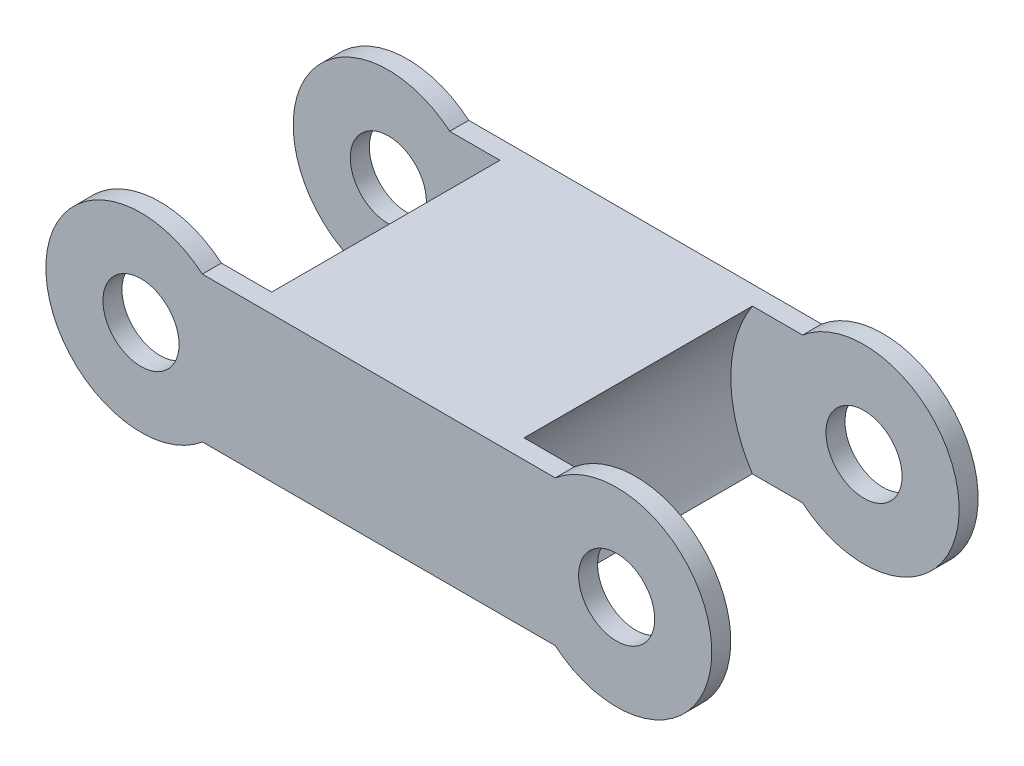
ISO-10303-21;
HEADER;
FILE_DESCRIPTION(('STEP AP214'),'2;1');
FILE_NAME('part.step','',(''),(''),'','','');
FILE_SCHEMA(('AUTOMOTIVE_DESIGN { 1 0 10303 214 1 1 1 1 }'));
ENDSEC;
DATA;
#1=APPLICATION_CONTEXT('core data for automotive mechanical design processes');
#2=APPLICATION_PROTOCOL_DEFINITION('international standard','automotive_design',2000,#1);
#3=PRODUCT_CONTEXT('',#1,'mechanical');
#4=PRODUCT('Part','Part','',(#3));
#5=PRODUCT_RELATED_PRODUCT_CATEGORY('part','',(#4));
#6=PRODUCT_DEFINITION_FORMATION('','',#4);
#7=PRODUCT_DEFINITION_CONTEXT('part definition',#1,'design');
#8=PRODUCT_DEFINITION('design','',#6,#7);
#9=PRODUCT_DEFINITION_SHAPE('','',#8);
#10=(LENGTH_UNIT() NAMED_UNIT(*) SI_UNIT(.MILLI.,.METRE.));
#11=(NAMED_UNIT(*) PLANE_ANGLE_UNIT() SI_UNIT($,.RADIAN.));
#12=(NAMED_UNIT(*) SI_UNIT($,.STERADIAN.) SOLID_ANGLE_UNIT());
#13=UNCERTAINTY_MEASURE_WITH_UNIT(LENGTH_MEASURE(1.E-05),#10,'distance_accuracy_value','');
#14=(GEOMETRIC_REPRESENTATION_CONTEXT(3) GLOBAL_UNCERTAINTY_ASSIGNED_CONTEXT((#13)) GLOBAL_UNIT_ASSIGNED_CONTEXT((#10,
#11,#12)) REPRESENTATION_CONTEXT('',''));
#15=CARTESIAN_POINT('',(0.,0.,0.));
#16=DIRECTION('',(0.,0.,1.));
#17=DIRECTION('',(1.,0.,0.));
#18=AXIS2_PLACEMENT_3D('',#15,#16,#17);
#19=CARTESIAN_POINT('',(0.,-8.62727902108439,-14.));
#20=DIRECTION('',(0.,-1.,0.));
#21=DIRECTION('',(0.,0.,-1.));
#22=AXIS2_PLACEMENT_3D('',#19,#20,#21);
#23=PLANE('',#22);
#24=DIRECTION('',(0.,0.,-1.));
#25=VECTOR('',#24,1.);
#26=CARTESIAN_POINT('',(-12.5604431779841,-8.62727902108439,12.));
#27=LINE('',#26,#25);
#28=CARTESIAN_POINT('',(-12.5604431779841,-8.62727902108439,-12.));
#29=VERTEX_POINT('',#28);
#30=CARTESIAN_POINT('',(-12.5604431779841,-8.62727902108439,12.));
#31=VERTEX_POINT('',#30);
#32=EDGE_CURVE('E246',#29,#31,#27,.F.);
#33=ORIENTED_EDGE('',*,*,#32,.F.);
#34=DIRECTION('',(1.,0.,0.));
#35=VECTOR('',#34,1.);
#36=CARTESIAN_POINT('',(0.,-8.62727902108439,-12.));
#37=LINE('',#36,#35);
#38=CARTESIAN_POINT('',(-17.8396055816999,-8.62727902108439,-12.));
#39=VERTEX_POINT('',#38);
#40=EDGE_CURVE('E265',#39,#29,#37,.T.);
#41=ORIENTED_EDGE('',*,*,#40,.F.);
#42=DIRECTION('',(0.,0.,1.));
#43=VECTOR('',#42,1.);
#44=CARTESIAN_POINT('',(-17.8396055816999,-8.62727902108439,-14.));
#45=LINE('',#44,#43);
#46=CARTESIAN_POINT('',(-17.8396055816999,-8.62727902108439,-14.));
#47=VERTEX_POINT('',#46);
#48=EDGE_CURVE('E134',#47,#39,#45,.T.);
#49=ORIENTED_EDGE('',*,*,#48,.F.);
#50=DIRECTION('',(1.,0.,0.));
#51=VECTOR('',#50,1.);
#52=CARTESIAN_POINT('',(0.,-8.62727902108439,-14.));
#53=LINE('',#52,#51);
#54=CARTESIAN_POINT('',(19.2548538978497,-8.62727902108438,-14.));
#55=VERTEX_POINT('',#54);
#56=EDGE_CURVE('E295',#47,#55,#53,.T.);
#57=ORIENTED_EDGE('',*,*,#56,.T.);
#58=DIRECTION('',(0.,0.,1.));
#59=VECTOR('',#58,1.);
#60=CARTESIAN_POINT('',(19.2548538978497,-8.62727902108438,-14.));
#61=LINE('',#60,#59);
#62=CARTESIAN_POINT('',(19.2548538978497,-8.62727902108438,-12.));
#63=VERTEX_POINT('',#62);
#64=EDGE_CURVE('E323',#55,#63,#61,.T.);
#65=ORIENTED_EDGE('',*,*,#64,.T.);
#66=DIRECTION('',(1.,0.,0.));
#67=VECTOR('',#66,1.);
#68=CARTESIAN_POINT('',(0.,-8.62727902108439,-12.));
#69=LINE('',#68,#67);
#70=CARTESIAN_POINT('',(13.9756914941339,-8.62727902108439,-12.));
#71=VERTEX_POINT('',#70);
#72=EDGE_CURVE('E227',#71,#63,#69,.T.);
#73=ORIENTED_EDGE('',*,*,#72,.F.);
#74=DIRECTION('',(0.,0.,-1.));
#75=VECTOR('',#74,1.);
#76=CARTESIAN_POINT('',(13.9756914941339,-8.62727902108439,12.));
#77=LINE('',#76,#75);
#78=CARTESIAN_POINT('',(13.9756914941339,-8.62727902108439,12.));
#79=VERTEX_POINT('',#78);
#80=EDGE_CURVE('E234',#71,#79,#77,.F.);
#81=ORIENTED_EDGE('',*,*,#80,.T.);
#82=DIRECTION('',(1.,0.,0.));
#83=VECTOR('',#82,1.);
#84=CARTESIAN_POINT('',(0.,-8.62727902108439,12.));
#85=LINE('',#84,#83);
#86=CARTESIAN_POINT('',(19.2548538978497,-8.62727902108438,12.));
#87=VERTEX_POINT('',#86);
#88=EDGE_CURVE('E254',#79,#87,#85,.T.);
#89=ORIENTED_EDGE('',*,*,#88,.T.);
#90=CARTESIAN_POINT('',(19.2548538978497,-8.62727902108438,14.));
#91=VERTEX_POINT('',#90);
#92=EDGE_CURVE('E312',#87,#91,#61,.T.);
#93=ORIENTED_EDGE('',*,*,#92,.T.);
#94=DIRECTION('',(1.,0.,0.));
#95=VECTOR('',#94,1.);
#96=CARTESIAN_POINT('',(0.,-8.62727902108439,14.));
#97=LINE('',#96,#95);
#98=CARTESIAN_POINT('',(-17.8396055816999,-8.62727902108439,14.));
#99=VERTEX_POINT('',#98);
#100=EDGE_CURVE('E277',#99,#91,#97,.T.);
#101=ORIENTED_EDGE('',*,*,#100,.F.);
#102=CARTESIAN_POINT('',(-17.8396055816999,-8.62727902108439,12.));
#103=VERTEX_POINT('',#102);
#104=EDGE_CURVE('E315',#103,#99,#45,.T.);
#105=ORIENTED_EDGE('',*,*,#104,.F.);
#106=DIRECTION('',(1.,0.,0.));
#107=VECTOR('',#106,1.);
#108=CARTESIAN_POINT('',(0.,-8.62727902108439,12.));
#109=LINE('',#108,#107);
#110=EDGE_CURVE('E273',#103,#31,#109,.T.);
#111=ORIENTED_EDGE('',*,*,#110,.T.);
#112=EDGE_LOOP('',(#33,#41,#49,#57,#65,#73,#81,#89,#93,#101,#105,#111));
#113=FACE_BOUND('',#112,.T.);
#114=ADVANCED_FACE('F127',(#113),#23,.T.);
#115=CARTESIAN_POINT('',(-24.2923758419251,-0.987792391162618,-14.));
#116=DIRECTION('',(0.,0.,1.));
#117=DIRECTION('',(1.,0.,0.));
#118=AXIS2_PLACEMENT_3D('',#115,#116,#117);
#119=CYLINDRICAL_SURFACE('',#118,10.);
#120=DIRECTION('',(0.,0.,1.));
#121=VECTOR('',#120,1.);
#122=CARTESIAN_POINT('',(-17.8396055816999,6.65169423875915,-14.));
#123=LINE('',#122,#121);
#124=CARTESIAN_POINT('',(-17.8396055816999,6.65169423875915,12.));
#125=VERTEX_POINT('',#124);
#126=CARTESIAN_POINT('',(-17.8396055816999,6.65169423875915,14.));
#127=VERTEX_POINT('',#126);
#128=EDGE_CURVE('E319',#125,#127,#123,.T.);
#129=ORIENTED_EDGE('',*,*,#128,.F.);
#130=CARTESIAN_POINT('',(-24.2923758419251,-0.987792391162618,12.));
#131=DIRECTION('',(0.,0.,-1.));
#132=DIRECTION('',(-1.,0.,0.));
#133=AXIS2_PLACEMENT_3D('',#130,#131,#132);
#134=CIRCLE('',#133,10.);
#135=EDGE_CURVE('E270',#125,#103,#134,.F.);
#136=ORIENTED_EDGE('',*,*,#135,.T.);
#137=ORIENTED_EDGE('',*,*,#104,.T.);
#138=CARTESIAN_POINT('',(-24.2923758419251,-0.987792391162618,14.));
#139=DIRECTION('',(0.,0.,1.));
#140=DIRECTION('',(1.,0.,0.));
#141=AXIS2_PLACEMENT_3D('',#138,#139,#140);
#142=CIRCLE('',#141,10.);
#143=EDGE_CURVE('E286',#127,#99,#142,.T.);
#144=ORIENTED_EDGE('',*,*,#143,.F.);
#145=EDGE_LOOP('',(#129,#136,#137,#144));
#146=FACE_BOUND('',#145,.T.);
#147=ADVANCED_FACE('F345',(#146),#119,.T.);
#148=CARTESIAN_POINT('',(0.,6.65169423875915,-14.));
#149=DIRECTION('',(0.,-1.,0.));
#150=DIRECTION('',(0.,0.,-1.));
#151=AXIS2_PLACEMENT_3D('',#148,#149,#150);
#152=PLANE('',#151);
#153=DIRECTION('',(0.,0.,1.));
#154=VECTOR('',#153,1.);
#155=CARTESIAN_POINT('',(13.9756914941339,6.65169423875915,-12.));
#156=LINE('',#155,#154);
#157=CARTESIAN_POINT('',(13.9756914941339,6.65169423875915,-12.));
#158=VERTEX_POINT('',#157);
#159=CARTESIAN_POINT('',(13.9756914941339,6.65169423875915,12.));
#160=VERTEX_POINT('',#159);
#161=EDGE_CURVE('E232',#158,#160,#156,.T.);
#162=ORIENTED_EDGE('',*,*,#161,.F.);
#163=DIRECTION('',(1.,0.,0.));
#164=VECTOR('',#163,1.);
#165=CARTESIAN_POINT('',(0.,6.65169423875915,-12.));
#166=LINE('',#165,#164);
#167=CARTESIAN_POINT('',(19.2548538978497,6.65169423875915,-12.));
#168=VERTEX_POINT('',#167);
#169=EDGE_CURVE('E215',#158,#168,#166,.T.);
#170=ORIENTED_EDGE('',*,*,#169,.T.);
#171=DIRECTION('',(0.,0.,1.));
#172=VECTOR('',#171,1.);
#173=CARTESIAN_POINT('',(19.2548538978497,6.65169423875915,-14.));
#174=LINE('',#173,#172);
#175=CARTESIAN_POINT('',(19.2548538978497,6.65169423875915,-14.));
#176=VERTEX_POINT('',#175);
#177=EDGE_CURVE('E320',#176,#168,#174,.T.);
#178=ORIENTED_EDGE('',*,*,#177,.F.);
#179=DIRECTION('',(1.,0.,0.));
#180=VECTOR('',#179,1.);
#181=CARTESIAN_POINT('',(0.,6.65169423875915,-14.));
#182=LINE('',#181,#180);
#183=CARTESIAN_POINT('',(-17.8396055816999,6.65169423875915,-14.));
#184=VERTEX_POINT('',#183);
#185=EDGE_CURVE('E301',#184,#176,#182,.T.);
#186=ORIENTED_EDGE('',*,*,#185,.F.);
#187=CARTESIAN_POINT('',(-17.8396055816999,6.65169423875915,-12.));
#188=VERTEX_POINT('',#187);
#189=EDGE_CURVE('E316',#184,#188,#123,.T.);
#190=ORIENTED_EDGE('',*,*,#189,.T.);
#191=DIRECTION('',(1.,0.,0.));
#192=VECTOR('',#191,1.);
#193=CARTESIAN_POINT('',(0.,6.65169423875915,-12.));
#194=LINE('',#193,#192);
#195=CARTESIAN_POINT('',(-12.5604431779841,6.65169423875915,-12.));
#196=VERTEX_POINT('',#195);
#197=EDGE_CURVE('E260',#188,#196,#194,.T.);
#198=ORIENTED_EDGE('',*,*,#197,.T.);
#199=DIRECTION('',(0.,0.,-1.));
#200=VECTOR('',#199,1.);
#201=CARTESIAN_POINT('',(-12.5604431779841,6.65169423875915,12.));
#202=LINE('',#201,#200);
#203=CARTESIAN_POINT('',(-12.5604431779841,6.65169423875915,12.));
#204=VERTEX_POINT('',#203);
#205=EDGE_CURVE('E12',#204,#196,#202,.T.);
#206=ORIENTED_EDGE('',*,*,#205,.F.);
#207=DIRECTION('',(1.,0.,0.));
#208=VECTOR('',#207,1.);
#209=CARTESIAN_POINT('',(0.,6.65169423875915,12.));
#210=LINE('',#209,#208);
#211=EDGE_CURVE('E268',#125,#204,#210,.T.);
#212=ORIENTED_EDGE('',*,*,#211,.F.);
#213=ORIENTED_EDGE('',*,*,#128,.T.);
#214=DIRECTION('',(1.,0.,0.));
#215=VECTOR('',#214,1.);
#216=CARTESIAN_POINT('',(0.,6.65169423875915,14.));
#217=LINE('',#216,#215);
#218=CARTESIAN_POINT('',(19.2548538978497,6.65169423875915,14.));
#219=VERTEX_POINT('',#218);
#220=EDGE_CURVE('E283',#127,#219,#217,.T.);
#221=ORIENTED_EDGE('',*,*,#220,.T.);
#222=CARTESIAN_POINT('',(19.2548538978497,6.65169423875915,12.));
#223=VERTEX_POINT('',#222);
#224=EDGE_CURVE('E322',#223,#219,#174,.T.);
#225=ORIENTED_EDGE('',*,*,#224,.F.);
#226=DIRECTION('',(1.,0.,0.));
#227=VECTOR('',#226,1.);
#228=CARTESIAN_POINT('',(0.,6.65169423875915,12.));
#229=LINE('',#228,#227);
#230=EDGE_CURVE('E148',#160,#223,#229,.T.);
#231=ORIENTED_EDGE('',*,*,#230,.F.);
#232=EDGE_LOOP('',(#162,#170,#178,#186,#190,#198,#206,#212,#213,#221,#225,#231));
#233=FACE_BOUND('',#232,.T.);
#234=ADVANCED_FACE('F237',(#233),#152,.F.);
#235=CARTESIAN_POINT('',(-24.2923758419251,-0.987792391162618,-14.));
#236=DIRECTION('',(0.,0.,1.));
#237=DIRECTION('',(1.,0.,0.));
#238=AXIS2_PLACEMENT_3D('',#235,#236,#237);
#239=CYLINDRICAL_SURFACE('',#238,4.);
#240=CARTESIAN_POINT('',(-24.2923758419251,-0.987792391162618,14.));
#241=DIRECTION('',(0.,0.,1.));
#242=DIRECTION('',(1.,0.,0.));
#243=AXIS2_PLACEMENT_3D('',#240,#241,#242);
#244=CIRCLE('',#243,4.);
#245=CARTESIAN_POINT('',(-20.2923758419251,-0.987792391162618,14.));
#246=VERTEX_POINT('',#245);
#247=EDGE_CURVE('E289',#246,#246,#244,.T.);
#248=ORIENTED_EDGE('',*,*,#247,.T.);
#249=EDGE_LOOP('',(#248));
#250=FACE_BOUND('',#249,.T.);
#251=CARTESIAN_POINT('',(-24.2923758419251,-0.987792391162618,12.));
#252=DIRECTION('',(0.,0.,-1.));
#253=DIRECTION('',(-1.,0.,0.));
#254=AXIS2_PLACEMENT_3D('',#251,#252,#253);
#255=CIRCLE('',#254,4.);
#256=CARTESIAN_POINT('',(-28.2923758419251,-0.987792391162618,12.));
#257=VERTEX_POINT('',#256);
#258=EDGE_CURVE('E267',#257,#257,#255,.F.);
#259=ORIENTED_EDGE('',*,*,#258,.F.);
#260=EDGE_LOOP('',(#259));
#261=FACE_BOUND('',#260,.T.);
#262=ADVANCED_FACE('F332',(#250,#261),#239,.F.);
#263=CARTESIAN_POINT('',(25.7076241580749,-0.987792391162618,-14.));
#264=DIRECTION('',(0.,0.,1.));
#265=DIRECTION('',(1.,0.,0.));
#266=AXIS2_PLACEMENT_3D('',#263,#264,#265);
#267=CYLINDRICAL_SURFACE('',#266,10.);
#268=ORIENTED_EDGE('',*,*,#92,.F.);
#269=CARTESIAN_POINT('',(25.7076241580749,-0.987792391162618,12.));
#270=DIRECTION('',(0.,0.,-1.));
#271=DIRECTION('',(-1.,0.,0.));
#272=AXIS2_PLACEMENT_3D('',#269,#270,#271);
#273=CIRCLE('',#272,10.);
#274=EDGE_CURVE('E239',#87,#223,#273,.F.);
#275=ORIENTED_EDGE('',*,*,#274,.T.);
#276=ORIENTED_EDGE('',*,*,#224,.T.);
#277=CARTESIAN_POINT('',(25.7076241580749,-0.987792391162618,14.));
#278=DIRECTION('',(0.,0.,1.));
#279=DIRECTION('',(1.,0.,0.));
#280=AXIS2_PLACEMENT_3D('',#277,#278,#279);
#281=CIRCLE('',#280,10.);
#282=EDGE_CURVE('E280',#91,#219,#281,.T.);
#283=ORIENTED_EDGE('',*,*,#282,.F.);
#284=EDGE_LOOP('',(#268,#275,#276,#283));
#285=FACE_BOUND('',#284,.T.);
#286=ADVANCED_FACE('F334',(#285),#267,.T.);
#287=CARTESIAN_POINT('',(25.7076241580749,-0.987792391162618,-14.));
#288=DIRECTION('',(0.,0.,1.));
#289=DIRECTION('',(1.,0.,0.));
#290=AXIS2_PLACEMENT_3D('',#287,#288,#289);
#291=CYLINDRICAL_SURFACE('',#290,4.);
#292=CARTESIAN_POINT('',(25.7076241580749,-0.987792391162618,14.));
#293=DIRECTION('',(0.,0.,1.));
#294=DIRECTION('',(1.,0.,0.));
#295=AXIS2_PLACEMENT_3D('',#292,#293,#294);
#296=CIRCLE('',#295,4.);
#297=CARTESIAN_POINT('',(29.7076241580749,-0.987792391162618,14.));
#298=VERTEX_POINT('',#297);
#299=EDGE_CURVE('E292',#298,#298,#296,.T.);
#300=ORIENTED_EDGE('',*,*,#299,.T.);
#301=EDGE_LOOP('',(#300));
#302=FACE_BOUND('',#301,.T.);
#303=CARTESIAN_POINT('',(25.7076241580749,-0.987792391162618,12.));
#304=DIRECTION('',(0.,0.,1.));
#305=DIRECTION('',(1.,0.,0.));
#306=AXIS2_PLACEMENT_3D('',#303,#304,#305);
#307=CIRCLE('',#306,4.);
#308=CARTESIAN_POINT('',(29.7076241580749,-0.987792391162618,12.));
#309=VERTEX_POINT('',#308);
#310=EDGE_CURVE('E251',#309,#309,#307,.T.);
#311=ORIENTED_EDGE('',*,*,#310,.F.);
#312=EDGE_LOOP('',(#311));
#313=FACE_BOUND('',#312,.T.);
#314=ADVANCED_FACE('F342',(#302,#313),#291,.F.);
#315=CARTESIAN_POINT('',(-24.2923758419251,-0.987792391162618,-12.));
#316=DIRECTION('',(0.,0.,-1.));
#317=DIRECTION('',(-1.,0.,0.));
#318=AXIS2_PLACEMENT_3D('',#315,#316,#317);
#319=CIRCLE('',#318,10.);
#320=EDGE_CURVE('E263',#188,#39,#319,.F.);
#321=ORIENTED_EDGE('',*,*,#320,.F.);
#322=ORIENTED_EDGE('',*,*,#189,.F.);
#323=CARTESIAN_POINT('',(-24.2923758419251,-0.987792391162618,-14.));
#324=DIRECTION('',(0.,0.,1.));
#325=DIRECTION('',(1.,0.,0.));
#326=AXIS2_PLACEMENT_3D('',#323,#324,#325);
#327=CIRCLE('',#326,10.);
#328=EDGE_CURVE('E303',#184,#47,#327,.T.);
#329=ORIENTED_EDGE('',*,*,#328,.T.);
#330=ORIENTED_EDGE('',*,*,#48,.T.);
#331=EDGE_LOOP('',(#321,#322,#329,#330));
#332=FACE_BOUND('',#331,.T.);
#333=ADVANCED_FACE('F350',(#332),#119,.T.);
#334=CARTESIAN_POINT('',(-24.2923758419251,-0.987792391162618,-12.));
#335=DIRECTION('',(0.,0.,-1.));
#336=DIRECTION('',(-1.,0.,0.));
#337=AXIS2_PLACEMENT_3D('',#334,#335,#336);
#338=CIRCLE('',#337,4.);
#339=CARTESIAN_POINT('',(-28.2923758419251,-0.987792391162618,-12.));
#340=VERTEX_POINT('',#339);
#341=EDGE_CURVE('E259',#340,#340,#338,.F.);
#342=ORIENTED_EDGE('',*,*,#341,.T.);
#343=EDGE_LOOP('',(#342));
#344=FACE_BOUND('',#343,.T.);
#345=CARTESIAN_POINT('',(-24.2923758419251,-0.987792391162618,-14.));
#346=DIRECTION('',(0.,0.,1.));
#347=DIRECTION('',(1.,0.,0.));
#348=AXIS2_PLACEMENT_3D('',#345,#346,#347);
#349=CIRCLE('',#348,4.);
#350=CARTESIAN_POINT('',(-20.2923758419251,-0.987792391162618,-14.));
#351=VERTEX_POINT('',#350);
#352=EDGE_CURVE('E306',#351,#351,#349,.T.);
#353=ORIENTED_EDGE('',*,*,#352,.F.);
#354=EDGE_LOOP('',(#353));
#355=FACE_BOUND('',#354,.T.);
#356=ADVANCED_FACE('F337',(#344,#355),#239,.F.);
#357=CARTESIAN_POINT('',(25.7076241580749,-0.987792391162618,-12.));
#358=DIRECTION('',(0.,0.,-1.));
#359=DIRECTION('',(-1.,0.,0.));
#360=AXIS2_PLACEMENT_3D('',#357,#358,#359);
#361=CIRCLE('',#360,10.);
#362=EDGE_CURVE('E222',#63,#168,#361,.F.);
#363=ORIENTED_EDGE('',*,*,#362,.F.);
#364=ORIENTED_EDGE('',*,*,#64,.F.);
#365=CARTESIAN_POINT('',(25.7076241580749,-0.987792391162618,-14.));
#366=DIRECTION('',(0.,0.,1.));
#367=DIRECTION('',(1.,0.,0.));
#368=AXIS2_PLACEMENT_3D('',#365,#366,#367);
#369=CIRCLE('',#368,10.);
#370=EDGE_CURVE('E298',#55,#176,#369,.T.);
#371=ORIENTED_EDGE('',*,*,#370,.T.);
#372=ORIENTED_EDGE('',*,*,#177,.T.);
#373=EDGE_LOOP('',(#363,#364,#371,#372));
#374=FACE_BOUND('',#373,.T.);
#375=ADVANCED_FACE('F344',(#374),#267,.T.);
#376=CARTESIAN_POINT('',(25.7076241580749,-0.987792391162618,-12.));
#377=DIRECTION('',(0.,0.,1.));
#378=DIRECTION('',(1.,0.,0.));
#379=AXIS2_PLACEMENT_3D('',#376,#377,#378);
#380=CIRCLE('',#379,4.);
#381=CARTESIAN_POINT('',(29.7076241580749,-0.987792391162618,-12.));
#382=VERTEX_POINT('',#381);
#383=EDGE_CURVE('E235',#382,#382,#380,.T.);
#384=ORIENTED_EDGE('',*,*,#383,.T.);
#385=EDGE_LOOP('',(#384));
#386=FACE_BOUND('',#385,.T.);
#387=CARTESIAN_POINT('',(25.7076241580749,-0.987792391162618,-14.));
#388=DIRECTION('',(0.,0.,1.));
#389=DIRECTION('',(1.,0.,0.));
#390=AXIS2_PLACEMENT_3D('',#387,#388,#389);
#391=CIRCLE('',#390,4.);
#392=CARTESIAN_POINT('',(29.7076241580749,-0.987792391162618,-14.));
#393=VERTEX_POINT('',#392);
#394=EDGE_CURVE('E309',#393,#393,#391,.T.);
#395=ORIENTED_EDGE('',*,*,#394,.F.);
#396=EDGE_LOOP('',(#395));
#397=FACE_BOUND('',#396,.T.);
#398=ADVANCED_FACE('F381',(#386,#397),#291,.F.);
#399=CARTESIAN_POINT('',(0.,0.,-14.));
#400=DIRECTION('',(0.,0.,1.));
#401=DIRECTION('',(1.,0.,0.));
#402=AXIS2_PLACEMENT_3D('',#399,#400,#401);
#403=PLANE('',#402);
#404=ORIENTED_EDGE('',*,*,#56,.F.);
#405=ORIENTED_EDGE('',*,*,#328,.F.);
#406=ORIENTED_EDGE('',*,*,#185,.T.);
#407=ORIENTED_EDGE('',*,*,#370,.F.);
#408=EDGE_LOOP('',(#404,#405,#406,#407));
#409=FACE_BOUND('',#408,.T.);
#410=ORIENTED_EDGE('',*,*,#352,.T.);
#411=EDGE_LOOP('',(#410));
#412=FACE_BOUND('',#411,.T.);
#413=ORIENTED_EDGE('',*,*,#394,.T.);
#414=EDGE_LOOP('',(#413));
#415=FACE_BOUND('',#414,.T.);
#416=ADVANCED_FACE('F377',(#409,#412,#415),#403,.F.);
#417=CARTESIAN_POINT('',(0.,0.,14.));
#418=DIRECTION('',(0.,0.,1.));
#419=DIRECTION('',(1.,0.,0.));
#420=AXIS2_PLACEMENT_3D('',#417,#418,#419);
#421=PLANE('',#420);
#422=ORIENTED_EDGE('',*,*,#100,.T.);
#423=ORIENTED_EDGE('',*,*,#282,.T.);
#424=ORIENTED_EDGE('',*,*,#220,.F.);
#425=ORIENTED_EDGE('',*,*,#143,.T.);
#426=EDGE_LOOP('',(#422,#423,#424,#425));
#427=FACE_BOUND('',#426,.T.);
#428=ORIENTED_EDGE('',*,*,#247,.F.);
#429=EDGE_LOOP('',(#428));
#430=FACE_BOUND('',#429,.T.);
#431=ORIENTED_EDGE('',*,*,#299,.F.);
#432=EDGE_LOOP('',(#431));
#433=FACE_BOUND('',#432,.T.);
#434=ADVANCED_FACE('F397',(#427,#430,#433),#421,.T.);
#435=CARTESIAN_POINT('',(0.,0.,-12.));
#436=DIRECTION('',(0.,0.,-1.));
#437=DIRECTION('',(-1.,0.,0.));
#438=AXIS2_PLACEMENT_3D('',#435,#436,#437);
#439=PLANE('',#438);
#440=ORIENTED_EDGE('',*,*,#72,.T.);
#441=ORIENTED_EDGE('',*,*,#362,.T.);
#442=ORIENTED_EDGE('',*,*,#169,.F.);
#443=CARTESIAN_POINT('',(25.7076241580749,-0.987792391162618,-12.));
#444=DIRECTION('',(0.,0.,1.));
#445=DIRECTION('',(1.,0.,0.));
#446=AXIS2_PLACEMENT_3D('',#443,#444,#445);
#447=CIRCLE('',#446,14.);
#448=EDGE_CURVE('E219',#158,#71,#447,.T.);
#449=ORIENTED_EDGE('',*,*,#448,.T.);
#450=EDGE_LOOP('',(#440,#441,#442,#449));
#451=FACE_BOUND('',#450,.T.);
#452=ORIENTED_EDGE('',*,*,#383,.F.);
#453=EDGE_LOOP('',(#452));
#454=FACE_BOUND('',#453,.T.);
#455=ADVANCED_FACE('F217',(#451,#454),#439,.F.);
#456=CARTESIAN_POINT('',(0.,0.,12.));
#457=DIRECTION('',(0.,0.,-1.));
#458=DIRECTION('',(-1.,0.,0.));
#459=AXIS2_PLACEMENT_3D('',#456,#457,#458);
#460=PLANE('',#459);
#461=CARTESIAN_POINT('',(25.7076241580749,-0.987792391162618,12.));
#462=DIRECTION('',(0.,0.,1.));
#463=DIRECTION('',(1.,0.,0.));
#464=AXIS2_PLACEMENT_3D('',#461,#462,#463);
#465=CIRCLE('',#464,14.);
#466=EDGE_CURVE('E244',#160,#79,#465,.T.);
#467=ORIENTED_EDGE('',*,*,#466,.F.);
#468=ORIENTED_EDGE('',*,*,#230,.T.);
#469=ORIENTED_EDGE('',*,*,#274,.F.);
#470=ORIENTED_EDGE('',*,*,#88,.F.);
#471=EDGE_LOOP('',(#467,#468,#469,#470));
#472=FACE_BOUND('',#471,.T.);
#473=ORIENTED_EDGE('',*,*,#310,.T.);
#474=EDGE_LOOP('',(#473));
#475=FACE_BOUND('',#474,.T.);
#476=ADVANCED_FACE('F401',(#472,#475),#460,.T.);
#477=CARTESIAN_POINT('',(25.7076241580749,-0.987792391162618,12.));
#478=DIRECTION('',(0.,0.,-1.));
#479=DIRECTION('',(-1.,0.,0.));
#480=AXIS2_PLACEMENT_3D('',#477,#478,#479);
#481=CYLINDRICAL_SURFACE('',#480,14.);
#482=ORIENTED_EDGE('',*,*,#448,.F.);
#483=ORIENTED_EDGE('',*,*,#161,.T.);
#484=ORIENTED_EDGE('',*,*,#466,.T.);
#485=ORIENTED_EDGE('',*,*,#80,.F.);
#486=EDGE_LOOP('',(#482,#483,#484,#485));
#487=FACE_BOUND('',#486,.T.);
#488=ADVANCED_FACE('F230',(#487),#481,.F.);
#489=CARTESIAN_POINT('',(-24.2923758419251,-0.987792391162618,12.));
#490=DIRECTION('',(0.,0.,-1.));
#491=DIRECTION('',(-1.,0.,0.));
#492=AXIS2_PLACEMENT_3D('',#489,#490,#491);
#493=CYLINDRICAL_SURFACE('',#492,14.);
#494=ORIENTED_EDGE('',*,*,#205,.T.);
#495=CARTESIAN_POINT('',(-24.2923758419251,-0.987792391162618,-12.));
#496=DIRECTION('',(0.,0.,1.));
#497=DIRECTION('',(1.,0.,0.));
#498=AXIS2_PLACEMENT_3D('',#495,#496,#497);
#499=CIRCLE('',#498,14.);
#500=EDGE_CURVE('E249',#29,#196,#499,.T.);
#501=ORIENTED_EDGE('',*,*,#500,.F.);
#502=ORIENTED_EDGE('',*,*,#32,.T.);
#503=CARTESIAN_POINT('',(-24.2923758419251,-0.987792391162618,12.));
#504=DIRECTION('',(0.,0.,1.));
#505=DIRECTION('',(1.,0.,0.));
#506=AXIS2_PLACEMENT_3D('',#503,#504,#505);
#507=CIRCLE('',#506,14.);
#508=EDGE_CURVE('E140',#31,#204,#507,.T.);
#509=ORIENTED_EDGE('',*,*,#508,.T.);
#510=EDGE_LOOP('',(#494,#501,#502,#509));
#511=FACE_BOUND('',#510,.T.);
#512=ADVANCED_FACE('F362',(#511),#493,.F.);
#513=CARTESIAN_POINT('',(0.,0.,12.));
#514=DIRECTION('',(0.,0.,-1.));
#515=DIRECTION('',(-1.,0.,0.));
#516=AXIS2_PLACEMENT_3D('',#513,#514,#515);
#517=PLANE('',#516);
#518=ORIENTED_EDGE('',*,*,#135,.F.);
#519=ORIENTED_EDGE('',*,*,#211,.T.);
#520=ORIENTED_EDGE('',*,*,#508,.F.);
#521=ORIENTED_EDGE('',*,*,#110,.F.);
#522=EDGE_LOOP('',(#518,#519,#520,#521));
#523=FACE_BOUND('',#522,.T.);
#524=ORIENTED_EDGE('',*,*,#258,.T.);
#525=EDGE_LOOP('',(#524));
#526=FACE_BOUND('',#525,.T.);
#527=ADVANCED_FACE('F330',(#523,#526),#517,.T.);
#528=CARTESIAN_POINT('',(0.,0.,-12.));
#529=DIRECTION('',(0.,0.,-1.));
#530=DIRECTION('',(-1.,0.,0.));
#531=AXIS2_PLACEMENT_3D('',#528,#529,#530);
#532=PLANE('',#531);
#533=ORIENTED_EDGE('',*,*,#40,.T.);
#534=ORIENTED_EDGE('',*,*,#500,.T.);
#535=ORIENTED_EDGE('',*,*,#197,.F.);
#536=ORIENTED_EDGE('',*,*,#320,.T.);
#537=EDGE_LOOP('',(#533,#534,#535,#536));
#538=FACE_BOUND('',#537,.T.);
#539=ORIENTED_EDGE('',*,*,#341,.F.);
#540=EDGE_LOOP('',(#539));
#541=FACE_BOUND('',#540,.T.);
#542=ADVANCED_FACE('F368',(#538,#541),#532,.F.);
#543=CLOSED_SHELL('',(#114,#147,#234,#262,#286,#314,#333,#356,#375,#398,#416,#434,#455,#476,
#488,#512,#527,#542));
#544=MANIFOLD_SOLID_BREP('B2',#543);
#545=ADVANCED_BREP_SHAPE_REPRESENTATION('',(#18,#544),#14);
#546=SHAPE_DEFINITION_REPRESENTATION(#9,#545);
ENDSEC;
END-ISO-10303-21;
